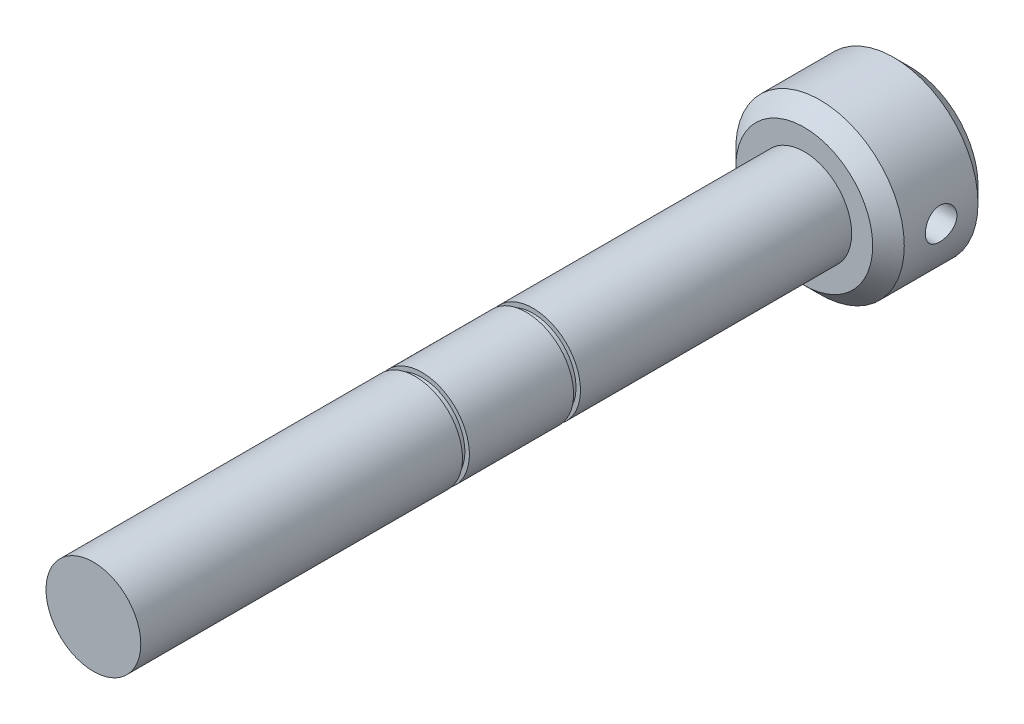
ISO-10303-21;
HEADER;
FILE_DESCRIPTION(('STEP AP214'),'2;1');
FILE_NAME('part.step','',(''),(''),'','','');
FILE_SCHEMA(('AUTOMOTIVE_DESIGN { 1 0 10303 214 1 1 1 1 }'));
ENDSEC;
DATA;
#1=APPLICATION_CONTEXT('core data for automotive mechanical design processes');
#2=APPLICATION_PROTOCOL_DEFINITION('international standard','automotive_design',2000,#1);
#3=PRODUCT_CONTEXT('',#1,'mechanical');
#4=PRODUCT('Part','Part','',(#3));
#5=PRODUCT_RELATED_PRODUCT_CATEGORY('part','',(#4));
#6=PRODUCT_DEFINITION_FORMATION('','',#4);
#7=PRODUCT_DEFINITION_CONTEXT('part definition',#1,'design');
#8=PRODUCT_DEFINITION('design','',#6,#7);
#9=PRODUCT_DEFINITION_SHAPE('','',#8);
#10=(LENGTH_UNIT() NAMED_UNIT(*) SI_UNIT(.MILLI.,.METRE.));
#11=(NAMED_UNIT(*) PLANE_ANGLE_UNIT() SI_UNIT($,.RADIAN.));
#12=(NAMED_UNIT(*) SI_UNIT($,.STERADIAN.) SOLID_ANGLE_UNIT());
#13=UNCERTAINTY_MEASURE_WITH_UNIT(LENGTH_MEASURE(1.E-05),#10,'distance_accuracy_value','');
#14=(GEOMETRIC_REPRESENTATION_CONTEXT(3) GLOBAL_UNCERTAINTY_ASSIGNED_CONTEXT((#13)) GLOBAL_UNIT_ASSIGNED_CONTEXT((#10,
#11,#12)) REPRESENTATION_CONTEXT('',''));
#15=CARTESIAN_POINT('',(0.,0.,0.));
#16=DIRECTION('',(0.,0.,1.));
#17=DIRECTION('',(1.,0.,0.));
#18=AXIS2_PLACEMENT_3D('',#15,#16,#17);
#19=CARTESIAN_POINT('',(0.,0.,20.));
#20=DIRECTION('',(0.,0.,-1.));
#21=DIRECTION('',(-1.,0.,0.));
#22=AXIS2_PLACEMENT_3D('',#19,#20,#21);
#23=CYLINDRICAL_SURFACE('',#22,16.);
#24=CARTESIAN_POINT('',(0.,0.,3.00000000000003));
#25=DIRECTION('',(0.,0.,1.));
#26=DIRECTION('',(1.,0.,0.));
#27=AXIS2_PLACEMENT_3D('',#24,#25,#26);
#28=CIRCLE('',#27,16.);
#29=CARTESIAN_POINT('',(16.,0.,3.00000000000003));
#30=VERTEX_POINT('',#29);
#31=EDGE_CURVE('E53',#30,#30,#28,.T.);
#32=ORIENTED_EDGE('',*,*,#31,.T.);
#33=EDGE_LOOP('',(#32));
#34=FACE_BOUND('',#33,.T.);
#35=CARTESIAN_POINT('',(0.,0.,17.));
#36=DIRECTION('',(0.,0.,1.));
#37=DIRECTION('',(1.,0.,0.));
#38=AXIS2_PLACEMENT_3D('',#35,#36,#37);
#39=CIRCLE('',#38,16.);
#40=CARTESIAN_POINT('',(16.,0.,17.));
#41=VERTEX_POINT('',#40);
#42=EDGE_CURVE('E58',#41,#41,#39,.F.);
#43=ORIENTED_EDGE('',*,*,#42,.T.);
#44=EDGE_LOOP('',(#43));
#45=FACE_BOUND('',#44,.T.);
#46=CARTESIAN_POINT('',(-16.,0.,7.));
#47=CARTESIAN_POINT('',(-15.999996976677,0.166943492930935,7.00000637917655));
#48=CARTESIAN_POINT('',(-15.9973601984343,0.33396998546019,7.01398215323876));
#49=CARTESIAN_POINT('',(-15.9870957178104,0.663316259683588,7.06947999023669));
#50=CARTESIAN_POINT('',(-15.9794638033379,0.825631948304444,7.11102530127947));
#51=CARTESIAN_POINT('',(-15.9600627753092,1.1407459237036,7.22034540251868));
#52=CARTESIAN_POINT('',(-15.9482973989297,1.29355266137068,7.28809650490508));
#53=CARTESIAN_POINT('',(-15.9219142119957,1.58561594618801,7.44783775384563));
#54=CARTESIAN_POINT('',(-15.9072966323658,1.72487358895464,7.53982593828963));
#55=CARTESIAN_POINT('',(-15.8766267286101,1.987567431861,7.74659953600735));
#56=CARTESIAN_POINT('',(-15.860560697127,2.11081791006366,7.86161888934027));
#57=CARTESIAN_POINT('',(-15.828906369173,2.33639212270738,8.11068661817512));
#58=CARTESIAN_POINT('',(-15.8133181070906,2.43871435378482,8.24473635953857));
#59=CARTESIAN_POINT('',(-15.7842510249001,2.62029997331585,8.52937217672794));
#60=CARTESIAN_POINT('',(-15.7707898777236,2.6993744393921,8.68008074063447));
#61=CARTESIAN_POINT('',(-15.7476942642397,2.83101048664565,8.99293783035358));
#62=CARTESIAN_POINT('',(-15.7380594679392,2.88357435426195,9.15508536822243));
#63=CARTESIAN_POINT('',(-15.723845391491,2.96010107006999,9.48423046182882));
#64=CARTESIAN_POINT('',(-15.7192089073281,2.98438780384077,9.65115019440692));
#65=CARTESIAN_POINT('',(-15.7153439430552,3.00467616190692,9.98675476961649));
#66=CARTESIAN_POINT('',(-15.7161149779752,3.00068032270747,10.1554394526046));
#67=CARTESIAN_POINT('',(-15.7229258540351,2.96477959204724,10.4874390505321));
#68=CARTESIAN_POINT('',(-15.7288961629467,2.93324299992089,10.6507954286003));
#69=CARTESIAN_POINT('',(-15.7453236656933,2.84373598792413,10.9698568395652));
#70=CARTESIAN_POINT('',(-15.7557810501903,2.78576444478998,11.1255615470186));
#71=CARTESIAN_POINT('',(-15.7800771058518,2.64467294358599,11.4259773580005));
#72=CARTESIAN_POINT('',(-15.7939356764673,2.56140427064911,11.5706169411616));
#73=CARTESIAN_POINT('',(-15.8234594320584,2.37218737860832,11.8440094570805));
#74=CARTESIAN_POINT('',(-15.8391248003104,2.26623685778531,11.9727607754296));
#75=CARTESIAN_POINT('',(-15.8708000254433,2.03267811370595,12.2128499113449));
#76=CARTESIAN_POINT('',(-15.8868114204806,1.90475487372136,12.3238813049035));
#77=CARTESIAN_POINT('',(-15.9171477221664,1.63193607419765,12.5229544813508));
#78=CARTESIAN_POINT('',(-15.9314726119049,1.48704034451153,12.6109960337408));
#79=CARTESIAN_POINT('',(-15.9568507935502,1.18406997774933,12.76163550774));
#80=CARTESIAN_POINT('',(-15.9678999827258,1.02597912889298,12.8242015582358));
#81=CARTESIAN_POINT('',(-15.9854501080544,0.701278230797387,12.9218041861843));
#82=CARTESIAN_POINT('',(-15.9919515273599,0.534669088555568,12.9568436880907));
#83=CARTESIAN_POINT('',(-15.9996072128396,0.200297305806764,12.9979720620365));
#84=CARTESIAN_POINT('',(-16.0008390182456,0.0325880252682638,13.0044807830594));
#85=CARTESIAN_POINT('',(-15.9980308719646,-0.301522496184375,12.9894890409047));
#86=CARTESIAN_POINT('',(-15.9939911792886,-0.467923800960777,12.9679899538695));
#87=CARTESIAN_POINT('',(-15.9811422300081,-0.79336314643644,12.8979419296333));
#88=CARTESIAN_POINT('',(-15.9723704474806,-0.952448522092132,12.8496054349244));
#89=CARTESIAN_POINT('',(-15.95103684425,-1.26025726364927,12.7274845864424));
#90=CARTESIAN_POINT('',(-15.9384747662267,-1.40897992519021,12.6536985048684));
#91=CARTESIAN_POINT('',(-15.9107606071533,-1.69363334302643,12.481843743681));
#92=CARTESIAN_POINT('',(-15.8955817234913,-1.82940655403025,12.3835185229263));
#93=CARTESIAN_POINT('',(-15.8643868697942,-2.08267664652909,12.1657237252753));
#94=CARTESIAN_POINT('',(-15.8483708216937,-2.20017181952174,12.0462521739973));
#95=CARTESIAN_POINT('',(-15.817049513949,-2.41514591744096,11.7876553621771));
#96=CARTESIAN_POINT('',(-15.8017565172051,-2.51233832437154,11.6482901837492));
#97=CARTESIAN_POINT('',(-15.7738597115706,-2.68193350115574,11.3549647509525));
#98=CARTESIAN_POINT('',(-15.761255802747,-2.75433719227849,11.2010050392591));
#99=CARTESIAN_POINT('',(-15.7402604841915,-2.87189347025647,10.8835882655149));
#100=CARTESIAN_POINT('',(-15.7318488087376,-2.91717737589573,10.7201812408813));
#101=CARTESIAN_POINT('',(-15.7201440760483,-2.97961358652472,10.3879055549572));
#102=CARTESIAN_POINT('',(-15.7168504413158,-2.99676906541417,10.2190375120592));
#103=CARTESIAN_POINT('',(-15.7157839960771,-3.0023552429671,9.88350333711697));
#104=CARTESIAN_POINT('',(-15.7179243194859,-2.99123790006998,9.71684483808601));
#105=CARTESIAN_POINT('',(-15.7272920132,-2.94158350757607,9.38781715590942));
#106=CARTESIAN_POINT('',(-15.7345193531149,-2.90304662178665,9.22544794714512));
#107=CARTESIAN_POINT('',(-15.7532101604636,-2.79983775166527,8.90985103040904));
#108=CARTESIAN_POINT('',(-15.7646656918993,-2.73521470794505,8.75660681730846));
#109=CARTESIAN_POINT('',(-15.7905277510368,-2.58171737824409,8.46306349151831));
#110=CARTESIAN_POINT('',(-15.8049344872024,-2.49284137896372,8.32276529431043));
#111=CARTESIAN_POINT('',(-15.8353453221549,-2.29178974679071,8.05683263991541));
#112=CARTESIAN_POINT('',(-15.8513701070609,-2.17928519728608,7.93144917486579));
#113=CARTESIAN_POINT('',(-15.8830566783747,-1.93485585348459,7.70118967507095));
#114=CARTESIAN_POINT('',(-15.8987183805466,-1.80292660378324,7.59631835803973));
#115=CARTESIAN_POINT('',(-15.928079519361,-1.52196989014375,7.40917809474588));
#116=CARTESIAN_POINT('',(-15.9417600198112,-1.37279918128104,7.32712114301872));
#117=CARTESIAN_POINT('',(-15.9654323876137,-1.06258022730767,7.18936472678973));
#118=CARTESIAN_POINT('',(-15.9754277175807,-0.901543303410503,7.13364050590618));
#119=CARTESIAN_POINT('',(-15.9885658141526,-0.616694405650314,7.06144537116265));
#120=CARTESIAN_POINT('',(-15.9928294175641,-0.494547620503747,7.0384427393744));
#121=CARTESIAN_POINT('',(-15.9985475990802,-0.248282494230322,7.0077178757671));
#122=CARTESIAN_POINT('',(-16.0000022485961,-0.124164203305425,6.99999525548818));
#123=CARTESIAN_POINT('',(-16.,0.,7.));
#124=B_SPLINE_CURVE_WITH_KNOTS('',3,(#46,#47,#48,#49,#50,#51,#52,#53,#54,#55,#56,#57,#58,#59,
#60,#61,#62,#63,#64,#65,#66,#67,#68,#69,#70,#71,#72,#73,#74,#75,#76,#77,#78,#79,#80,#81,#82,#83,
#84,#85,#86,#87,#88,#89,#90,#91,#92,#93,#94,#95,#96,#97,#98,#99,#100,#101,#102,#103,#104,#105,
#106,#107,#108,#109,#110,#111,#112,#113,#114,#115,#116,#117,#118,#119,#120,#121,#122,#123),
.UNSPECIFIED.,.T.,.F.,(4,2,2,2,2,2,2,2,2,2,2,2,2,2,2,2,2,2,2,2,2,2,2,2,2,2,2,2,2,2,2,2,2,2,2,2,
2,2,4),(0.,0.500376401929848,1.0011752850709,1.50152254246181,2.00182930673781,2.50750236027261,
3.01321172567233,3.52292381008715,4.03259192623897,4.53636302890671,5.04008895174512,
5.5371800122553,6.03429219693573,6.53438525259061,7.03452908099719,7.54255536928154,
8.05058675089895,8.55925176643397,9.0678627334749,9.56896348152193,10.0700396092917,
10.5672046781566,11.0644035067606,11.5670355603542,12.069714568262,12.579068739746,
13.0884039790989,13.5952525563712,14.1020439389302,14.600785044635,15.0995231708301,
15.5973299241538,16.0951718531085,16.6004673993276,17.1058790252451,17.6158409783263,
18.1253225386235,18.4974868904882,18.8696417807908),.UNSPECIFIED.);
#125=CARTESIAN_POINT('',(-16.,0.,7.));
#126=VERTEX_POINT('',#125);
#127=EDGE_CURVE('E64',#126,#126,#124,.T.);
#128=ORIENTED_EDGE('',*,*,#127,.T.);
#129=EDGE_LOOP('',(#128));
#130=FACE_BOUND('',#129,.T.);
#131=CARTESIAN_POINT('',(16.,0.,7.));
#132=CARTESIAN_POINT('',(15.999996976677,-0.166943492930942,7.00000637917655));
#133=CARTESIAN_POINT('',(15.9973601984343,-0.333969985460197,7.01398215323876));
#134=CARTESIAN_POINT('',(15.9870957178104,-0.663316259683595,7.06947999023669));
#135=CARTESIAN_POINT('',(15.9794638033379,-0.825631948304451,7.11102530127946));
#136=CARTESIAN_POINT('',(15.9600627753092,-1.1407459237036,7.22034540251868));
#137=CARTESIAN_POINT('',(15.9482973989297,-1.29355266137069,7.28809650490508));
#138=CARTESIAN_POINT('',(15.9219142119957,-1.58561594618801,7.44783775384563));
#139=CARTESIAN_POINT('',(15.9072966323658,-1.72487358895465,7.53982593828963));
#140=CARTESIAN_POINT('',(15.8766267286101,-1.98756743186101,7.74659953600734));
#141=CARTESIAN_POINT('',(15.860560697127,-2.11081791006367,7.86161888934027));
#142=CARTESIAN_POINT('',(15.828906369173,-2.33639212270739,8.11068661817511));
#143=CARTESIAN_POINT('',(15.8133181070905,-2.43871435378483,8.24473635953856));
#144=CARTESIAN_POINT('',(15.7842510249001,-2.62029997331586,8.52937217672793));
#145=CARTESIAN_POINT('',(15.7707898777236,-2.69937443939211,8.68008074063446));
#146=CARTESIAN_POINT('',(15.7476942642397,-2.83101048664567,8.99293783035357));
#147=CARTESIAN_POINT('',(15.7380594679392,-2.88357435426197,9.15508536822242));
#148=CARTESIAN_POINT('',(15.723845391491,-2.96010107007001,9.48423046182881));
#149=CARTESIAN_POINT('',(15.7192089073281,-2.98438780384079,9.65115019440692));
#150=CARTESIAN_POINT('',(15.7153439430552,-3.00467616190693,9.98675476961649));
#151=CARTESIAN_POINT('',(15.7161149779752,-3.00068032270749,10.1554394526046));
#152=CARTESIAN_POINT('',(15.7229258540351,-2.96477959204726,10.4874390505321));
#153=CARTESIAN_POINT('',(15.7288961629467,-2.9332429999209,10.6507954286003));
#154=CARTESIAN_POINT('',(15.7453236656933,-2.84373598792415,10.9698568395652));
#155=CARTESIAN_POINT('',(15.7557810501903,-2.78576444478999,11.1255615470186));
#156=CARTESIAN_POINT('',(15.7800771058518,-2.64467294358601,11.4259773580005));
#157=CARTESIAN_POINT('',(15.7939356764673,-2.56140427064913,11.5706169411616));
#158=CARTESIAN_POINT('',(15.8234594320584,-2.37218737860833,11.8440094570805));
#159=CARTESIAN_POINT('',(15.8391248003104,-2.26623685778533,11.9727607754296));
#160=CARTESIAN_POINT('',(15.8708000254433,-2.03267811370596,12.2128499113449));
#161=CARTESIAN_POINT('',(15.8868114204806,-1.90475487372138,12.3238813049035));
#162=CARTESIAN_POINT('',(15.9171477221664,-1.63193607419766,12.5229544813508));
#163=CARTESIAN_POINT('',(15.9314726119049,-1.48704034451155,12.6109960337408));
#164=CARTESIAN_POINT('',(15.9568507935502,-1.18406997774935,12.76163550774));
#165=CARTESIAN_POINT('',(15.9678999827258,-1.025979128893,12.8242015582358));
#166=CARTESIAN_POINT('',(15.9854501080544,-0.701278230797406,12.9218041861843));
#167=CARTESIAN_POINT('',(15.9919515273599,-0.534669088555587,12.9568436880907));
#168=CARTESIAN_POINT('',(15.9996072128396,-0.200297305806783,12.9979720620365));
#169=CARTESIAN_POINT('',(16.0008390182456,-0.0325880252682829,13.0044807830594));
#170=CARTESIAN_POINT('',(15.9980308719646,0.301522496184356,12.9894890409047));
#171=CARTESIAN_POINT('',(15.9939911792886,0.467923800960758,12.9679899538695));
#172=CARTESIAN_POINT('',(15.9811422300081,0.793363146436421,12.8979419296333));
#173=CARTESIAN_POINT('',(15.9723704474806,0.952448522092113,12.8496054349244));
#174=CARTESIAN_POINT('',(15.95103684425,1.26025726364925,12.7274845864424));
#175=CARTESIAN_POINT('',(15.9384747662267,1.40897992519019,12.6536985048684));
#176=CARTESIAN_POINT('',(15.9107606071533,1.69363334302642,12.481843743681));
#177=CARTESIAN_POINT('',(15.8955817234913,1.82940655403023,12.3835185229263));
#178=CARTESIAN_POINT('',(15.8643868697942,2.08267664652908,12.1657237252753));
#179=CARTESIAN_POINT('',(15.8483708216937,2.20017181952172,12.0462521739973));
#180=CARTESIAN_POINT('',(15.817049513949,2.41514591744095,11.7876553621771));
#181=CARTESIAN_POINT('',(15.8017565172051,2.51233832437152,11.6482901837492));
#182=CARTESIAN_POINT('',(15.7738597115706,2.68193350115573,11.3549647509525));
#183=CARTESIAN_POINT('',(15.761255802747,2.75433719227847,11.2010050392591));
#184=CARTESIAN_POINT('',(15.7402604841915,2.87189347025645,10.8835882655149));
#185=CARTESIAN_POINT('',(15.7318488087376,2.91717737589572,10.7201812408813));
#186=CARTESIAN_POINT('',(15.7201440760483,2.9796135865247,10.3879055549572));
#187=CARTESIAN_POINT('',(15.7168504413158,2.99676906541416,10.2190375120592));
#188=CARTESIAN_POINT('',(15.7157839960771,3.00235524296709,9.88350333711698));
#189=CARTESIAN_POINT('',(15.7179243194859,2.99123790006997,9.71684483808601));
#190=CARTESIAN_POINT('',(15.7272920132,2.94158350757605,9.38781715590943));
#191=CARTESIAN_POINT('',(15.7345193531149,2.90304662178663,9.22544794714512));
#192=CARTESIAN_POINT('',(15.7532101604636,2.79983775166526,8.90985103040904));
#193=CARTESIAN_POINT('',(15.7646656918993,2.73521470794504,8.75660681730846));
#194=CARTESIAN_POINT('',(15.7905277510368,2.58171737824408,8.46306349151831));
#195=CARTESIAN_POINT('',(15.8049344872024,2.49284137896371,8.32276529431044));
#196=CARTESIAN_POINT('',(15.8353453221549,2.2917897467907,8.05683263991541));
#197=CARTESIAN_POINT('',(15.8513701070609,2.17928519728607,7.9314491748658));
#198=CARTESIAN_POINT('',(15.8830566783747,1.93485585348458,7.70118967507096));
#199=CARTESIAN_POINT('',(15.8987183805466,1.80292660378323,7.59631835803973));
#200=CARTESIAN_POINT('',(15.928079519361,1.52196989014374,7.40917809474588));
#201=CARTESIAN_POINT('',(15.9417600198112,1.37279918128103,7.32712114301872));
#202=CARTESIAN_POINT('',(15.9654323876137,1.06258022730767,7.18936472678973));
#203=CARTESIAN_POINT('',(15.9754277175807,0.901543303410494,7.13364050590618));
#204=CARTESIAN_POINT('',(15.9885658141526,0.616694405650307,7.06144537116265));
#205=CARTESIAN_POINT('',(15.9928294175641,0.494547620503741,7.0384427393744));
#206=CARTESIAN_POINT('',(15.9985475990802,0.248282494230316,7.0077178757671));
#207=CARTESIAN_POINT('',(16.0000022485961,0.124164203305419,6.99999525548818));
#208=CARTESIAN_POINT('',(16.,0.,7.));
#209=B_SPLINE_CURVE_WITH_KNOTS('',3,(#131,#132,#133,#134,#135,#136,#137,#138,#139,#140,#141,
#142,#143,#144,#145,#146,#147,#148,#149,#150,#151,#152,#153,#154,#155,#156,#157,#158,#159,#160,
#161,#162,#163,#164,#165,#166,#167,#168,#169,#170,#171,#172,#173,#174,#175,#176,#177,#178,#179,
#180,#181,#182,#183,#184,#185,#186,#187,#188,#189,#190,#191,#192,#193,#194,#195,#196,#197,#198,
#199,#200,#201,#202,#203,#204,#205,#206,#207,#208),.UNSPECIFIED.,.T.,.F.,(4,2,2,2,2,2,2,2,2,2,2,
2,2,2,2,2,2,2,2,2,2,2,2,2,2,2,2,2,2,2,2,2,2,2,2,2,2,2,4),(0.,0.500376401929848,1.0011752850709,
1.50152254246181,2.00182930673781,2.50750236027261,3.01321172567233,3.52292381008715,
4.03259192623897,4.53636302890671,5.04008895174512,5.53718001225531,6.03429219693573,
6.53438525259061,7.03452908099719,7.54255536928154,8.05058675089895,8.55925176643397,
9.0678627334749,9.56896348152193,10.0700396092917,10.5672046781566,11.0644035067606,
11.5670355603542,12.069714568262,12.579068739746,13.0884039790989,13.5952525563712,
14.1020439389302,14.600785044635,15.0995231708301,15.5973299241538,16.0951718531085,
16.6004673993276,17.1058790252451,17.6158409783263,18.1253225386235,18.4974868904882,
18.8696417807908),.UNSPECIFIED.);
#210=CARTESIAN_POINT('',(16.,0.,7.));
#211=VERTEX_POINT('',#210);
#212=EDGE_CURVE('E73',#211,#211,#209,.T.);
#213=ORIENTED_EDGE('',*,*,#212,.T.);
#214=EDGE_LOOP('',(#213));
#215=FACE_BOUND('',#214,.T.);
#216=ADVANCED_FACE('F40',(#34,#45,#130,#215),#23,.T.);
#217=CARTESIAN_POINT('',(0.,0.,20.));
#218=DIRECTION('',(0.,0.,1.));
#219=DIRECTION('',(1.,0.,0.));
#220=AXIS2_PLACEMENT_3D('',#217,#218,#219);
#221=PLANE('',#220);
#222=CARTESIAN_POINT('',(0.,0.,20.));
#223=DIRECTION('',(0.,0.,1.));
#224=DIRECTION('',(1.,0.,0.));
#225=AXIS2_PLACEMENT_3D('',#222,#223,#224);
#226=CIRCLE('',#225,13.);
#227=CARTESIAN_POINT('',(13.,0.,20.));
#228=VERTEX_POINT('',#227);
#229=EDGE_CURVE('E10',#228,#228,#226,.T.);
#230=ORIENTED_EDGE('',*,*,#229,.T.);
#231=EDGE_LOOP('',(#230));
#232=FACE_BOUND('',#231,.T.);
#233=CARTESIAN_POINT('',(0.,0.,20.));
#234=DIRECTION('',(0.,0.,1.));
#235=DIRECTION('',(1.,0.,0.));
#236=AXIS2_PLACEMENT_3D('',#233,#234,#235);
#237=CIRCLE('',#236,9.);
#238=CARTESIAN_POINT('',(9.,0.,20.));
#239=VERTEX_POINT('',#238);
#240=EDGE_CURVE('E142',#239,#239,#237,.T.);
#241=ORIENTED_EDGE('',*,*,#240,.F.);
#242=EDGE_LOOP('',(#241));
#243=FACE_BOUND('',#242,.T.);
#244=ADVANCED_FACE('F122',(#232,#243),#221,.T.);
#245=CARTESIAN_POINT('',(0.,0.,0.));
#246=DIRECTION('',(0.,0.,1.));
#247=DIRECTION('',(1.,0.,0.));
#248=AXIS2_PLACEMENT_3D('',#245,#246,#247);
#249=PLANE('',#248);
#250=CARTESIAN_POINT('',(0.,0.,0.));
#251=DIRECTION('',(0.,0.,1.));
#252=DIRECTION('',(1.,0.,0.));
#253=AXIS2_PLACEMENT_3D('',#250,#251,#252);
#254=CIRCLE('',#253,13.);
#255=CARTESIAN_POINT('',(13.,0.,0.));
#256=VERTEX_POINT('',#255);
#257=EDGE_CURVE('E48',#256,#256,#254,.F.);
#258=ORIENTED_EDGE('',*,*,#257,.T.);
#259=EDGE_LOOP('',(#258));
#260=FACE_BOUND('',#259,.T.);
#261=ADVANCED_FACE('F120',(#260),#249,.F.);
#262=CARTESIAN_POINT('',(0.,0.,155.));
#263=DIRECTION('',(0.,0.,-1.));
#264=DIRECTION('',(-1.,0.,0.));
#265=AXIS2_PLACEMENT_3D('',#262,#263,#264);
#266=CYLINDRICAL_SURFACE('',#265,9.);
#267=CARTESIAN_POINT('',(0.,0.,71.5));
#268=DIRECTION('',(0.,0.,-1.));
#269=DIRECTION('',(-1.,0.,0.));
#270=AXIS2_PLACEMENT_3D('',#267,#268,#269);
#271=CIRCLE('',#270,9.);
#272=CARTESIAN_POINT('',(-9.,0.,71.5));
#273=VERTEX_POINT('',#272);
#274=EDGE_CURVE('E177',#273,#273,#271,.T.);
#275=ORIENTED_EDGE('',*,*,#274,.T.);
#276=EDGE_LOOP('',(#275));
#277=FACE_BOUND('',#276,.T.);
#278=ORIENTED_EDGE('',*,*,#240,.T.);
#279=EDGE_LOOP('',(#278));
#280=FACE_BOUND('',#279,.T.);
#281=ADVANCED_FACE('F100',(#277,#280),#266,.T.);
#282=CARTESIAN_POINT('',(0.,9.,72.8));
#283=DIRECTION('',(0.,0.,1.));
#284=DIRECTION('',(1.,0.,0.));
#285=AXIS2_PLACEMENT_3D('',#282,#283,#284);
#286=PLANE('',#285);
#287=CARTESIAN_POINT('',(0.,0.,72.8));
#288=DIRECTION('',(0.,0.,-1.));
#289=DIRECTION('',(-1.,0.,0.));
#290=AXIS2_PLACEMENT_3D('',#287,#288,#289);
#291=CIRCLE('',#290,8.15);
#292=CARTESIAN_POINT('',(-8.15,0.,72.8));
#293=VERTEX_POINT('',#292);
#294=EDGE_CURVE('E150',#293,#293,#291,.T.);
#295=ORIENTED_EDGE('',*,*,#294,.F.);
#296=EDGE_LOOP('',(#295));
#297=FACE_BOUND('',#296,.T.);
#298=CARTESIAN_POINT('',(0.,0.,72.8));
#299=DIRECTION('',(0.,0.,-1.));
#300=DIRECTION('',(-1.,0.,0.));
#301=AXIS2_PLACEMENT_3D('',#298,#299,#300);
#302=CIRCLE('',#301,9.);
#303=CARTESIAN_POINT('',(-9.,0.,72.8));
#304=VERTEX_POINT('',#303);
#305=EDGE_CURVE('E157',#304,#304,#302,.T.);
#306=ORIENTED_EDGE('',*,*,#305,.T.);
#307=EDGE_LOOP('',(#306));
#308=FACE_BOUND('',#307,.T.);
#309=ADVANCED_FACE('F96',(#297,#308),#286,.F.);
#310=CARTESIAN_POINT('',(0.,0.,0.));
#311=DIRECTION('',(0.,0.,-1.));
#312=DIRECTION('',(-1.,0.,0.));
#313=AXIS2_PLACEMENT_3D('',#310,#311,#312);
#314=CYLINDRICAL_SURFACE('',#313,8.15);
#315=CARTESIAN_POINT('',(0.,0.,71.5));
#316=DIRECTION('',(0.,0.,-1.));
#317=DIRECTION('',(-1.,0.,0.));
#318=AXIS2_PLACEMENT_3D('',#315,#316,#317);
#319=CIRCLE('',#318,8.15);
#320=CARTESIAN_POINT('',(-8.15,0.,71.5));
#321=VERTEX_POINT('',#320);
#322=EDGE_CURVE('E173',#321,#321,#319,.T.);
#323=ORIENTED_EDGE('',*,*,#322,.F.);
#324=EDGE_LOOP('',(#323));
#325=FACE_BOUND('',#324,.T.);
#326=ORIENTED_EDGE('',*,*,#294,.T.);
#327=EDGE_LOOP('',(#326));
#328=FACE_BOUND('',#327,.T.);
#329=ADVANCED_FACE('F92',(#325,#328),#314,.T.);
#330=CARTESIAN_POINT('',(0.,9.,71.5));
#331=DIRECTION('',(0.,0.,-1.));
#332=DIRECTION('',(-1.,0.,0.));
#333=AXIS2_PLACEMENT_3D('',#330,#331,#332);
#334=PLANE('',#333);
#335=ORIENTED_EDGE('',*,*,#274,.F.);
#336=EDGE_LOOP('',(#335));
#337=FACE_BOUND('',#336,.T.);
#338=ORIENTED_EDGE('',*,*,#322,.T.);
#339=EDGE_LOOP('',(#338));
#340=FACE_BOUND('',#339,.T.);
#341=ADVANCED_FACE('F87',(#337,#340),#334,.F.);
#342=ORIENTED_EDGE('',*,*,#305,.F.);
#343=EDGE_LOOP('',(#342));
#344=FACE_BOUND('',#343,.T.);
#345=CARTESIAN_POINT('',(0.,0.,92.6));
#346=DIRECTION('',(0.,0.,-1.));
#347=DIRECTION('',(-1.,0.,0.));
#348=AXIS2_PLACEMENT_3D('',#345,#346,#347);
#349=CIRCLE('',#348,9.);
#350=CARTESIAN_POINT('',(-9.,0.,92.6));
#351=VERTEX_POINT('',#350);
#352=EDGE_CURVE('E162',#351,#351,#349,.T.);
#353=ORIENTED_EDGE('',*,*,#352,.T.);
#354=EDGE_LOOP('',(#353));
#355=FACE_BOUND('',#354,.T.);
#356=ADVANCED_FACE('F91',(#344,#355),#266,.T.);
#357=CARTESIAN_POINT('',(0.,9.,93.9));
#358=DIRECTION('',(0.,0.,1.));
#359=DIRECTION('',(1.,0.,0.));
#360=AXIS2_PLACEMENT_3D('',#357,#358,#359);
#361=PLANE('',#360);
#362=CARTESIAN_POINT('',(0.,0.,93.9));
#363=DIRECTION('',(0.,0.,-1.));
#364=DIRECTION('',(-1.,0.,0.));
#365=AXIS2_PLACEMENT_3D('',#362,#363,#364);
#366=CIRCLE('',#365,8.15);
#367=CARTESIAN_POINT('',(-8.15,0.,93.9));
#368=VERTEX_POINT('',#367);
#369=EDGE_CURVE('E153',#368,#368,#366,.T.);
#370=ORIENTED_EDGE('',*,*,#369,.F.);
#371=EDGE_LOOP('',(#370));
#372=FACE_BOUND('',#371,.T.);
#373=CARTESIAN_POINT('',(0.,0.,93.9));
#374=DIRECTION('',(0.,0.,-1.));
#375=DIRECTION('',(-1.,0.,0.));
#376=AXIS2_PLACEMENT_3D('',#373,#374,#375);
#377=CIRCLE('',#376,9.);
#378=CARTESIAN_POINT('',(-9.,0.,93.9));
#379=VERTEX_POINT('',#378);
#380=EDGE_CURVE('E166',#379,#379,#377,.T.);
#381=ORIENTED_EDGE('',*,*,#380,.T.);
#382=EDGE_LOOP('',(#381));
#383=FACE_BOUND('',#382,.T.);
#384=ADVANCED_FACE('F110',(#372,#383),#361,.F.);
#385=CARTESIAN_POINT('',(0.,0.,0.));
#386=DIRECTION('',(0.,0.,-1.));
#387=DIRECTION('',(-1.,0.,0.));
#388=AXIS2_PLACEMENT_3D('',#385,#386,#387);
#389=CYLINDRICAL_SURFACE('',#388,8.15);
#390=CARTESIAN_POINT('',(0.,0.,92.6));
#391=DIRECTION('',(0.,0.,-1.));
#392=DIRECTION('',(-1.,0.,0.));
#393=AXIS2_PLACEMENT_3D('',#390,#391,#392);
#394=CIRCLE('',#393,8.15);
#395=CARTESIAN_POINT('',(-8.15,0.,92.6));
#396=VERTEX_POINT('',#395);
#397=EDGE_CURVE('E158',#396,#396,#394,.T.);
#398=ORIENTED_EDGE('',*,*,#397,.F.);
#399=EDGE_LOOP('',(#398));
#400=FACE_BOUND('',#399,.T.);
#401=ORIENTED_EDGE('',*,*,#369,.T.);
#402=EDGE_LOOP('',(#401));
#403=FACE_BOUND('',#402,.T.);
#404=ADVANCED_FACE('F106',(#400,#403),#389,.T.);
#405=CARTESIAN_POINT('',(0.,9.,92.6));
#406=DIRECTION('',(0.,0.,-1.));
#407=DIRECTION('',(-1.,0.,0.));
#408=AXIS2_PLACEMENT_3D('',#405,#406,#407);
#409=PLANE('',#408);
#410=ORIENTED_EDGE('',*,*,#352,.F.);
#411=EDGE_LOOP('',(#410));
#412=FACE_BOUND('',#411,.T.);
#413=ORIENTED_EDGE('',*,*,#397,.T.);
#414=EDGE_LOOP('',(#413));
#415=FACE_BOUND('',#414,.T.);
#416=ADVANCED_FACE('F102',(#412,#415),#409,.F.);
#417=CARTESIAN_POINT('',(0.,0.,155.));
#418=DIRECTION('',(0.,0.,1.));
#419=DIRECTION('',(1.,0.,0.));
#420=AXIS2_PLACEMENT_3D('',#417,#418,#419);
#421=PLANE('',#420);
#422=CARTESIAN_POINT('',(0.,0.,155.));
#423=DIRECTION('',(0.,0.,1.));
#424=DIRECTION('',(1.,0.,0.));
#425=AXIS2_PLACEMENT_3D('',#422,#423,#424);
#426=CIRCLE('',#425,9.);
#427=CARTESIAN_POINT('',(9.,0.,155.));
#428=VERTEX_POINT('',#427);
#429=EDGE_CURVE('E145',#428,#428,#426,.T.);
#430=ORIENTED_EDGE('',*,*,#429,.T.);
#431=EDGE_LOOP('',(#430));
#432=FACE_BOUND('',#431,.T.);
#433=ADVANCED_FACE('F105',(#432),#421,.T.);
#434=ORIENTED_EDGE('',*,*,#380,.F.);
#435=EDGE_LOOP('',(#434));
#436=FACE_BOUND('',#435,.T.);
#437=ORIENTED_EDGE('',*,*,#429,.F.);
#438=EDGE_LOOP('',(#437));
#439=FACE_BOUND('',#438,.T.);
#440=ADVANCED_FACE('F85',(#436,#439),#266,.T.);
#441=CARTESIAN_POINT('',(-16.,0.,10.));
#442=DIRECTION('',(1.,0.,0.));
#443=DIRECTION('',(0.,0.,-1.));
#444=AXIS2_PLACEMENT_3D('',#441,#442,#443);
#445=CYLINDRICAL_SURFACE('',#444,3.);
#446=ORIENTED_EDGE('',*,*,#212,.F.);
#447=EDGE_LOOP('',(#446));
#448=FACE_BOUND('',#447,.T.);
#449=ORIENTED_EDGE('',*,*,#127,.F.);
#450=EDGE_LOOP('',(#449));
#451=FACE_BOUND('',#450,.T.);
#452=ADVANCED_FACE('F80',(#448,#451),#445,.F.);
#453=CARTESIAN_POINT('',(0.,0.,3.00000000000003));
#454=DIRECTION('',(0.,0.,1.));
#455=DIRECTION('',(1.,0.,0.));
#456=AXIS2_PLACEMENT_3D('',#453,#454,#455);
#457=CONICAL_SURFACE('',#456,16.,0.785398163397451);
#458=ORIENTED_EDGE('',*,*,#257,.F.);
#459=EDGE_LOOP('',(#458));
#460=FACE_BOUND('',#459,.T.);
#461=ORIENTED_EDGE('',*,*,#31,.F.);
#462=EDGE_LOOP('',(#461));
#463=FACE_BOUND('',#462,.T.);
#464=ADVANCED_FACE('F84',(#460,#463),#457,.T.);
#465=CARTESIAN_POINT('',(0.,0.,20.));
#466=DIRECTION('',(0.,0.,-1.));
#467=DIRECTION('',(-1.,0.,0.));
#468=AXIS2_PLACEMENT_3D('',#465,#466,#467);
#469=CONICAL_SURFACE('',#468,13.,0.785398163397444);
#470=ORIENTED_EDGE('',*,*,#42,.F.);
#471=EDGE_LOOP('',(#470));
#472=FACE_BOUND('',#471,.T.);
#473=ORIENTED_EDGE('',*,*,#229,.F.);
#474=EDGE_LOOP('',(#473));
#475=FACE_BOUND('',#474,.T.);
#476=ADVANCED_FACE('F42',(#472,#475),#469,.T.);
#477=CLOSED_SHELL('',(#216,#244,#261,#281,#309,#329,#341,#356,#384,#404,#416,#433,#440,#452,
#464,#476));
#478=MANIFOLD_SOLID_BREP('B2',#477);
#479=ADVANCED_BREP_SHAPE_REPRESENTATION('',(#18,#478),#14);
#480=SHAPE_DEFINITION_REPRESENTATION(#9,#479);
ENDSEC;
END-ISO-10303-21;
